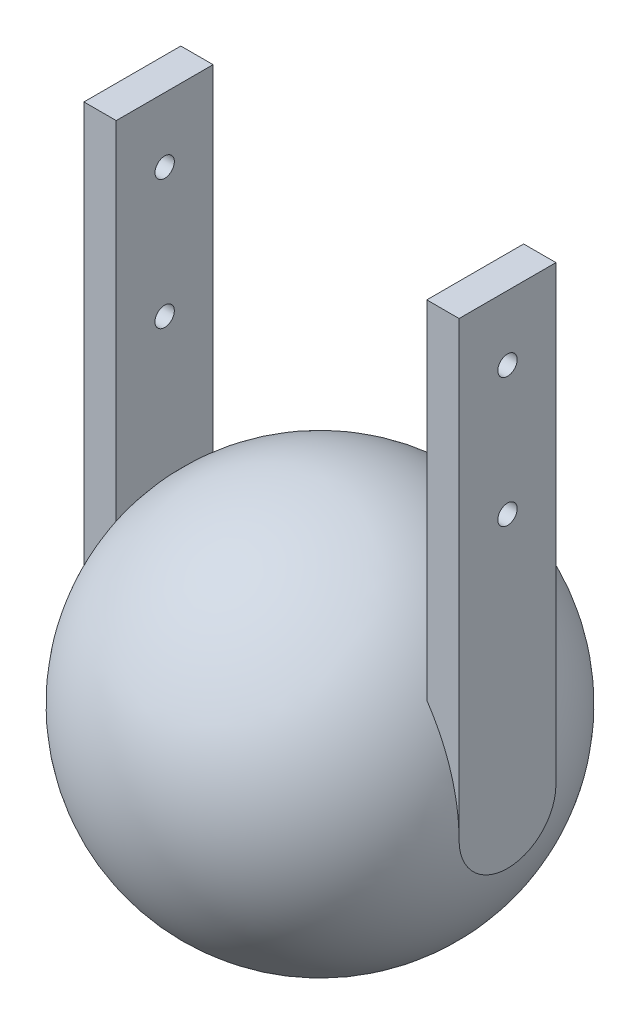
ISO-10303-21;
HEADER;
FILE_DESCRIPTION(('STEP AP214'),'2;1');
FILE_NAME('part.step','',(''),(''),'','','');
FILE_SCHEMA(('AUTOMOTIVE_DESIGN { 1 0 10303 214 1 1 1 1 }'));
ENDSEC;
DATA;
#1=APPLICATION_CONTEXT('core data for automotive mechanical design processes');
#2=APPLICATION_PROTOCOL_DEFINITION('international standard','automotive_design',2000,#1);
#3=PRODUCT_CONTEXT('',#1,'mechanical');
#4=PRODUCT('Part','Part','',(#3));
#5=PRODUCT_RELATED_PRODUCT_CATEGORY('part','',(#4));
#6=PRODUCT_DEFINITION_FORMATION('','',#4);
#7=PRODUCT_DEFINITION_CONTEXT('part definition',#1,'design');
#8=PRODUCT_DEFINITION('design','',#6,#7);
#9=PRODUCT_DEFINITION_SHAPE('','',#8);
#10=(LENGTH_UNIT() NAMED_UNIT(*) SI_UNIT(.MILLI.,.METRE.));
#11=(NAMED_UNIT(*) PLANE_ANGLE_UNIT() SI_UNIT($,.RADIAN.));
#12=(NAMED_UNIT(*) SI_UNIT($,.STERADIAN.) SOLID_ANGLE_UNIT());
#13=UNCERTAINTY_MEASURE_WITH_UNIT(LENGTH_MEASURE(1.E-05),#10,'distance_accuracy_value','');
#14=(GEOMETRIC_REPRESENTATION_CONTEXT(3) GLOBAL_UNCERTAINTY_ASSIGNED_CONTEXT((#13)) GLOBAL_UNIT_ASSIGNED_CONTEXT((#10,
#11,#12)) REPRESENTATION_CONTEXT('',''));
#15=CARTESIAN_POINT('',(0.,0.,0.));
#16=DIRECTION('',(0.,0.,1.));
#17=DIRECTION('',(1.,0.,0.));
#18=AXIS2_PLACEMENT_3D('',#15,#16,#17);
#19=CARTESIAN_POINT('',(0.,0.,0.));
#20=DIRECTION('',(-1.,0.,0.));
#21=DIRECTION('',(0.,0.,-1.));
#22=AXIS2_PLACEMENT_3D('',#19,#20,#21);
#23=SPHERICAL_SURFACE('',#22,30.);
#24=CARTESIAN_POINT('',(0.,0.,-7.5));
#25=DIRECTION('',(0.,0.,-1.));
#26=DIRECTION('',(0.,1.,0.));
#27=AXIS2_PLACEMENT_3D('',#24,#25,#26);
#28=CIRCLE('',#27,29.0473750965556);
#29=CARTESIAN_POINT('',(29.0473750965556,0.,-7.5));
#30=VERTEX_POINT('',#29);
#31=CARTESIAN_POINT('',(24.0473750965556,16.293365243729,-7.5));
#32=VERTEX_POINT('',#31);
#33=EDGE_CURVE('E116',#30,#32,#28,.F.);
#34=ORIENTED_EDGE('',*,*,#33,.F.);
#35=CARTESIAN_POINT('',(29.0473750965556,0.,0.));
#36=DIRECTION('',(-1.,0.,0.));
#37=DIRECTION('',(0.,0.,1.));
#38=AXIS2_PLACEMENT_3D('',#35,#36,#37);
#39=CIRCLE('',#38,7.5);
#40=CARTESIAN_POINT('',(29.0473750965556,0.,7.5));
#41=VERTEX_POINT('',#40);
#42=EDGE_CURVE('E195',#30,#41,#39,.T.);
#43=ORIENTED_EDGE('',*,*,#42,.T.);
#44=CARTESIAN_POINT('',(0.,0.,7.5));
#45=DIRECTION('',(0.,0.,1.));
#46=DIRECTION('',(0.,-1.,0.));
#47=AXIS2_PLACEMENT_3D('',#44,#45,#46);
#48=CIRCLE('',#47,29.0473750965556);
#49=CARTESIAN_POINT('',(24.0473750965556,16.293365243729,7.5));
#50=VERTEX_POINT('',#49);
#51=EDGE_CURVE('E67',#50,#41,#48,.F.);
#52=ORIENTED_EDGE('',*,*,#51,.F.);
#53=CARTESIAN_POINT('',(24.0473750965556,0.,0.));
#54=DIRECTION('',(1.,0.,0.));
#55=DIRECTION('',(0.,0.,-1.));
#56=AXIS2_PLACEMENT_3D('',#53,#54,#55);
#57=CIRCLE('',#56,17.9366594148842);
#58=EDGE_CURVE('E11',#50,#32,#57,.F.);
#59=ORIENTED_EDGE('',*,*,#58,.T.);
#60=EDGE_LOOP('',(#34,#43,#52,#59));
#61=FACE_BOUND('',#60,.T.);
#62=CARTESIAN_POINT('',(-24.0473750965556,0.,0.));
#63=DIRECTION('',(-1.,0.,0.));
#64=DIRECTION('',(0.,0.,1.));
#65=AXIS2_PLACEMENT_3D('',#62,#63,#64);
#66=CIRCLE('',#65,17.9366594148842);
#67=CARTESIAN_POINT('',(-24.0473750965556,16.293365243729,-7.5));
#68=VERTEX_POINT('',#67);
#69=CARTESIAN_POINT('',(-24.0473750965556,16.293365243729,7.5));
#70=VERTEX_POINT('',#69);
#71=EDGE_CURVE('E56',#68,#70,#66,.F.);
#72=ORIENTED_EDGE('',*,*,#71,.T.);
#73=CARTESIAN_POINT('',(0.,0.,7.5));
#74=DIRECTION('',(0.,0.,-1.));
#75=DIRECTION('',(0.,1.,0.));
#76=AXIS2_PLACEMENT_3D('',#73,#74,#75);
#77=CIRCLE('',#76,29.0473750965556);
#78=CARTESIAN_POINT('',(-29.0473750965556,0.,7.5));
#79=VERTEX_POINT('',#78);
#80=EDGE_CURVE('E191',#70,#79,#77,.F.);
#81=ORIENTED_EDGE('',*,*,#80,.T.);
#82=CARTESIAN_POINT('',(-29.0473750965556,0.,0.));
#83=DIRECTION('',(-1.,0.,0.));
#84=DIRECTION('',(0.,0.,1.));
#85=AXIS2_PLACEMENT_3D('',#82,#83,#84);
#86=CIRCLE('',#85,7.5);
#87=CARTESIAN_POINT('',(-29.0473750965556,0.,-7.5));
#88=VERTEX_POINT('',#87);
#89=EDGE_CURVE('E198',#88,#79,#86,.T.);
#90=ORIENTED_EDGE('',*,*,#89,.F.);
#91=CARTESIAN_POINT('',(0.,0.,-7.5));
#92=DIRECTION('',(0.,0.,1.));
#93=DIRECTION('',(0.,-1.,0.));
#94=AXIS2_PLACEMENT_3D('',#91,#92,#93);
#95=CIRCLE('',#94,29.0473750965556);
#96=EDGE_CURVE('E187',#88,#68,#95,.F.);
#97=ORIENTED_EDGE('',*,*,#96,.T.);
#98=EDGE_LOOP('',(#72,#81,#90,#97));
#99=FACE_BOUND('',#98,.T.);
#100=ADVANCED_FACE('F47',(#61,#99),#23,.T.);
#101=CARTESIAN_POINT('',(-29.0473750965556,0.,0.));
#102=DIRECTION('',(-1.,0.,0.));
#103=DIRECTION('',(0.,0.,1.));
#104=AXIS2_PLACEMENT_3D('',#101,#102,#103);
#105=PLANE('',#104);
#106=CARTESIAN_POINT('',(-29.0473750965556,60.,0.));
#107=DIRECTION('',(-1.,0.,0.));
#108=DIRECTION('',(0.,0.,1.));
#109=AXIS2_PLACEMENT_3D('',#106,#107,#108);
#110=CIRCLE('',#109,1.49999999999999);
#111=CARTESIAN_POINT('',(-29.0473750965556,60.,1.49999999999999));
#112=VERTEX_POINT('',#111);
#113=EDGE_CURVE('E229',#112,#112,#110,.T.);
#114=ORIENTED_EDGE('',*,*,#113,.F.);
#115=EDGE_LOOP('',(#114));
#116=FACE_BOUND('',#115,.T.);
#117=CARTESIAN_POINT('',(-29.0473750965556,40.,0.));
#118=DIRECTION('',(-1.,0.,0.));
#119=DIRECTION('',(0.,0.,1.));
#120=AXIS2_PLACEMENT_3D('',#117,#118,#119);
#121=CIRCLE('',#120,1.49999999999999);
#122=CARTESIAN_POINT('',(-29.0473750965556,40.,1.49999999999999));
#123=VERTEX_POINT('',#122);
#124=EDGE_CURVE('E214',#123,#123,#121,.T.);
#125=ORIENTED_EDGE('',*,*,#124,.F.);
#126=EDGE_LOOP('',(#125));
#127=FACE_BOUND('',#126,.T.);
#128=ORIENTED_EDGE('',*,*,#89,.T.);
#129=DIRECTION('',(0.,-1.,0.));
#130=VECTOR('',#129,1.);
#131=CARTESIAN_POINT('',(-29.0473750965556,70.,7.49999999999999));
#132=LINE('',#131,#130);
#133=CARTESIAN_POINT('',(-29.0473750965556,70.,7.49999999999999));
#134=VERTEX_POINT('',#133);
#135=EDGE_CURVE('E175',#134,#79,#132,.T.);
#136=ORIENTED_EDGE('',*,*,#135,.F.);
#137=DIRECTION('',(0.,0.,1.));
#138=VECTOR('',#137,1.);
#139=CARTESIAN_POINT('',(-29.0473750965556,70.,-7.49999999999999));
#140=LINE('',#139,#138);
#141=CARTESIAN_POINT('',(-29.0473750965556,70.,-7.49999999999999));
#142=VERTEX_POINT('',#141);
#143=EDGE_CURVE('E158',#142,#134,#140,.T.);
#144=ORIENTED_EDGE('',*,*,#143,.F.);
#145=DIRECTION('',(0.,1.,0.));
#146=VECTOR('',#145,1.);
#147=CARTESIAN_POINT('',(-29.0473750965556,0.,-7.5));
#148=LINE('',#147,#146);
#149=EDGE_CURVE('E164',#88,#142,#148,.T.);
#150=ORIENTED_EDGE('',*,*,#149,.F.);
#151=EDGE_LOOP('',(#128,#136,#144,#150));
#152=FACE_BOUND('',#151,.T.);
#153=ADVANCED_FACE('F237',(#116,#127,#152),#105,.T.);
#154=CARTESIAN_POINT('',(29.0473750965556,0.,-1.00778326990998E-13));
#155=DIRECTION('',(1.,0.,0.));
#156=DIRECTION('',(0.,0.,-1.));
#157=AXIS2_PLACEMENT_3D('',#154,#155,#156);
#158=PLANE('',#157);
#159=CARTESIAN_POINT('',(29.0473750965556,60.,0.));
#160=DIRECTION('',(-1.,0.,0.));
#161=DIRECTION('',(0.,0.,1.));
#162=AXIS2_PLACEMENT_3D('',#159,#160,#161);
#163=CIRCLE('',#162,1.49999999999999);
#164=CARTESIAN_POINT('',(29.0473750965556,60.,1.49999999999999));
#165=VERTEX_POINT('',#164);
#166=EDGE_CURVE('E225',#165,#165,#163,.T.);
#167=ORIENTED_EDGE('',*,*,#166,.T.);
#168=EDGE_LOOP('',(#167));
#169=FACE_BOUND('',#168,.T.);
#170=CARTESIAN_POINT('',(29.0473750965556,40.,0.));
#171=DIRECTION('',(-1.,0.,0.));
#172=DIRECTION('',(0.,0.,1.));
#173=AXIS2_PLACEMENT_3D('',#170,#171,#172);
#174=CIRCLE('',#173,1.49999999999999);
#175=CARTESIAN_POINT('',(29.0473750965556,40.,1.49999999999999));
#176=VERTEX_POINT('',#175);
#177=EDGE_CURVE('E207',#176,#176,#174,.T.);
#178=ORIENTED_EDGE('',*,*,#177,.T.);
#179=EDGE_LOOP('',(#178));
#180=FACE_BOUND('',#179,.T.);
#181=ORIENTED_EDGE('',*,*,#42,.F.);
#182=DIRECTION('',(0.,1.,0.));
#183=VECTOR('',#182,1.);
#184=CARTESIAN_POINT('',(29.0473750965556,0.,-7.5));
#185=LINE('',#184,#183);
#186=CARTESIAN_POINT('',(29.0473750965556,70.,-7.49999999999999));
#187=VERTEX_POINT('',#186);
#188=EDGE_CURVE('E140',#30,#187,#185,.T.);
#189=ORIENTED_EDGE('',*,*,#188,.T.);
#190=DIRECTION('',(0.,0.,1.));
#191=VECTOR('',#190,1.);
#192=CARTESIAN_POINT('',(29.0473750965556,70.,-7.49999999999999));
#193=LINE('',#192,#191);
#194=CARTESIAN_POINT('',(29.0473750965556,70.,7.49999999999999));
#195=VERTEX_POINT('',#194);
#196=EDGE_CURVE('E128',#187,#195,#193,.T.);
#197=ORIENTED_EDGE('',*,*,#196,.T.);
#198=DIRECTION('',(0.,-1.,0.));
#199=VECTOR('',#198,1.);
#200=CARTESIAN_POINT('',(29.0473750965556,70.,7.49999999999999));
#201=LINE('',#200,#199);
#202=EDGE_CURVE('E136',#195,#41,#201,.T.);
#203=ORIENTED_EDGE('',*,*,#202,.T.);
#204=EDGE_LOOP('',(#181,#189,#197,#203));
#205=FACE_BOUND('',#204,.T.);
#206=ADVANCED_FACE('F240',(#169,#180,#205),#158,.T.);
#207=CARTESIAN_POINT('',(-24.0473750965556,70.,-7.49999999999999));
#208=DIRECTION('',(0.,-1.,0.));
#209=DIRECTION('',(0.,0.,-1.));
#210=AXIS2_PLACEMENT_3D('',#207,#208,#209);
#211=PLANE('',#210);
#212=ORIENTED_EDGE('',*,*,#143,.T.);
#213=DIRECTION('',(-1.,0.,0.));
#214=VECTOR('',#213,1.);
#215=CARTESIAN_POINT('',(-24.0473750965556,70.,7.49999999999999));
#216=LINE('',#215,#214);
#217=CARTESIAN_POINT('',(-24.0473750965556,70.,7.49999999999999));
#218=VERTEX_POINT('',#217);
#219=EDGE_CURVE('E183',#218,#134,#216,.T.);
#220=ORIENTED_EDGE('',*,*,#219,.F.);
#221=DIRECTION('',(0.,0.,1.));
#222=VECTOR('',#221,1.);
#223=CARTESIAN_POINT('',(-24.0473750965556,70.,-7.49999999999999));
#224=LINE('',#223,#222);
#225=CARTESIAN_POINT('',(-24.0473750965556,70.,-7.49999999999999));
#226=VERTEX_POINT('',#225);
#227=EDGE_CURVE('E159',#226,#218,#224,.T.);
#228=ORIENTED_EDGE('',*,*,#227,.F.);
#229=DIRECTION('',(-1.,0.,0.));
#230=VECTOR('',#229,1.);
#231=CARTESIAN_POINT('',(-24.0473750965556,70.,-7.49999999999999));
#232=LINE('',#231,#230);
#233=EDGE_CURVE('E171',#226,#142,#232,.T.);
#234=ORIENTED_EDGE('',*,*,#233,.T.);
#235=EDGE_LOOP('',(#212,#220,#228,#234));
#236=FACE_BOUND('',#235,.T.);
#237=ADVANCED_FACE('F256',(#236),#211,.F.);
#238=CARTESIAN_POINT('',(-24.0473750965556,70.,7.49999999999999));
#239=DIRECTION('',(0.,0.,-1.));
#240=DIRECTION('',(0.,1.,0.));
#241=AXIS2_PLACEMENT_3D('',#238,#239,#240);
#242=PLANE('',#241);
#243=ORIENTED_EDGE('',*,*,#80,.F.);
#244=DIRECTION('',(0.,-1.,0.));
#245=VECTOR('',#244,1.);
#246=CARTESIAN_POINT('',(-24.0473750965556,70.,7.49999999999999));
#247=LINE('',#246,#245);
#248=EDGE_CURVE('E163',#218,#70,#247,.T.);
#249=ORIENTED_EDGE('',*,*,#248,.F.);
#250=ORIENTED_EDGE('',*,*,#219,.T.);
#251=ORIENTED_EDGE('',*,*,#135,.T.);
#252=EDGE_LOOP('',(#243,#249,#250,#251));
#253=FACE_BOUND('',#252,.T.);
#254=ADVANCED_FACE('F248',(#253),#242,.F.);
#255=CARTESIAN_POINT('',(-24.0473750965556,0.,-7.5));
#256=DIRECTION('',(0.,0.,1.));
#257=DIRECTION('',(0.,-1.,0.));
#258=AXIS2_PLACEMENT_3D('',#255,#256,#257);
#259=PLANE('',#258);
#260=ORIENTED_EDGE('',*,*,#96,.F.);
#261=ORIENTED_EDGE('',*,*,#149,.T.);
#262=ORIENTED_EDGE('',*,*,#233,.F.);
#263=DIRECTION('',(0.,1.,0.));
#264=VECTOR('',#263,1.);
#265=CARTESIAN_POINT('',(-24.0473750965556,0.,-7.5));
#266=LINE('',#265,#264);
#267=EDGE_CURVE('E168',#68,#226,#266,.T.);
#268=ORIENTED_EDGE('',*,*,#267,.F.);
#269=EDGE_LOOP('',(#260,#261,#262,#268));
#270=FACE_BOUND('',#269,.T.);
#271=ADVANCED_FACE('F258',(#270),#259,.F.);
#272=CARTESIAN_POINT('',(-24.0473750965556,0.,0.));
#273=DIRECTION('',(-1.,0.,0.));
#274=DIRECTION('',(0.,0.,1.));
#275=AXIS2_PLACEMENT_3D('',#272,#273,#274);
#276=PLANE('',#275);
#277=CARTESIAN_POINT('',(-24.0473750965556,60.,0.));
#278=DIRECTION('',(-1.,0.,0.));
#279=DIRECTION('',(0.,0.,1.));
#280=AXIS2_PLACEMENT_3D('',#277,#278,#279);
#281=CIRCLE('',#280,1.49999999999999);
#282=CARTESIAN_POINT('',(-24.0473750965556,60.,1.49999999999999));
#283=VERTEX_POINT('',#282);
#284=EDGE_CURVE('E50',#283,#283,#281,.T.);
#285=ORIENTED_EDGE('',*,*,#284,.T.);
#286=EDGE_LOOP('',(#285));
#287=FACE_BOUND('',#286,.T.);
#288=CARTESIAN_POINT('',(-24.0473750965556,40.,0.));
#289=DIRECTION('',(-1.,0.,0.));
#290=DIRECTION('',(0.,0.,1.));
#291=AXIS2_PLACEMENT_3D('',#288,#289,#290);
#292=CIRCLE('',#291,1.49999999999999);
#293=CARTESIAN_POINT('',(-24.0473750965556,40.,1.49999999999999));
#294=VERTEX_POINT('',#293);
#295=EDGE_CURVE('E143',#294,#294,#292,.T.);
#296=ORIENTED_EDGE('',*,*,#295,.T.);
#297=EDGE_LOOP('',(#296));
#298=FACE_BOUND('',#297,.T.);
#299=ORIENTED_EDGE('',*,*,#71,.F.);
#300=ORIENTED_EDGE('',*,*,#267,.T.);
#301=ORIENTED_EDGE('',*,*,#227,.T.);
#302=ORIENTED_EDGE('',*,*,#248,.T.);
#303=EDGE_LOOP('',(#299,#300,#301,#302));
#304=FACE_BOUND('',#303,.T.);
#305=ADVANCED_FACE('F250',(#287,#298,#304),#276,.F.);
#306=CARTESIAN_POINT('',(24.0473750965556,70.,-7.49999999999999));
#307=DIRECTION('',(0.,1.,0.));
#308=DIRECTION('',(0.,0.,1.));
#309=AXIS2_PLACEMENT_3D('',#306,#307,#308);
#310=PLANE('',#309);
#311=ORIENTED_EDGE('',*,*,#196,.F.);
#312=DIRECTION('',(1.,0.,0.));
#313=VECTOR('',#312,1.);
#314=CARTESIAN_POINT('',(24.0473750965556,70.,-7.49999999999999));
#315=LINE('',#314,#313);
#316=CARTESIAN_POINT('',(24.0473750965556,70.,-7.49999999999999));
#317=VERTEX_POINT('',#316);
#318=EDGE_CURVE('E114',#317,#187,#315,.T.);
#319=ORIENTED_EDGE('',*,*,#318,.F.);
#320=DIRECTION('',(0.,0.,1.));
#321=VECTOR('',#320,1.);
#322=CARTESIAN_POINT('',(24.0473750965556,70.,-7.49999999999999));
#323=LINE('',#322,#321);
#324=CARTESIAN_POINT('',(24.0473750965556,70.,7.49999999999999));
#325=VERTEX_POINT('',#324);
#326=EDGE_CURVE('E121',#317,#325,#323,.T.);
#327=ORIENTED_EDGE('',*,*,#326,.T.);
#328=DIRECTION('',(1.,0.,0.));
#329=VECTOR('',#328,1.);
#330=CARTESIAN_POINT('',(24.0473750965556,70.,7.49999999999999));
#331=LINE('',#330,#329);
#332=EDGE_CURVE('E131',#325,#195,#331,.T.);
#333=ORIENTED_EDGE('',*,*,#332,.T.);
#334=EDGE_LOOP('',(#311,#319,#327,#333));
#335=FACE_BOUND('',#334,.T.);
#336=ADVANCED_FACE('F125',(#335),#310,.T.);
#337=CARTESIAN_POINT('',(24.0473750965556,0.,-7.5));
#338=DIRECTION('',(0.,0.,-1.));
#339=DIRECTION('',(0.,1.,0.));
#340=AXIS2_PLACEMENT_3D('',#337,#338,#339);
#341=PLANE('',#340);
#342=ORIENTED_EDGE('',*,*,#188,.F.);
#343=ORIENTED_EDGE('',*,*,#33,.T.);
#344=DIRECTION('',(0.,1.,0.));
#345=VECTOR('',#344,1.);
#346=CARTESIAN_POINT('',(24.0473750965556,0.,-7.5));
#347=LINE('',#346,#345);
#348=EDGE_CURVE('E110',#32,#317,#347,.T.);
#349=ORIENTED_EDGE('',*,*,#348,.T.);
#350=ORIENTED_EDGE('',*,*,#318,.T.);
#351=EDGE_LOOP('',(#342,#343,#349,#350));
#352=FACE_BOUND('',#351,.T.);
#353=ADVANCED_FACE('F113',(#352),#341,.T.);
#354=CARTESIAN_POINT('',(24.0473750965556,70.,7.49999999999999));
#355=DIRECTION('',(0.,0.,1.));
#356=DIRECTION('',(0.,-1.,0.));
#357=AXIS2_PLACEMENT_3D('',#354,#355,#356);
#358=PLANE('',#357);
#359=DIRECTION('',(0.,-1.,0.));
#360=VECTOR('',#359,1.);
#361=CARTESIAN_POINT('',(24.0473750965556,70.,7.49999999999999));
#362=LINE('',#361,#360);
#363=EDGE_CURVE('E120',#325,#50,#362,.T.);
#364=ORIENTED_EDGE('',*,*,#363,.T.);
#365=ORIENTED_EDGE('',*,*,#51,.T.);
#366=ORIENTED_EDGE('',*,*,#202,.F.);
#367=ORIENTED_EDGE('',*,*,#332,.F.);
#368=EDGE_LOOP('',(#364,#365,#366,#367));
#369=FACE_BOUND('',#368,.T.);
#370=ADVANCED_FACE('F274',(#369),#358,.T.);
#371=CARTESIAN_POINT('',(24.0473750965556,0.,0.));
#372=DIRECTION('',(1.,0.,0.));
#373=DIRECTION('',(0.,0.,1.));
#374=AXIS2_PLACEMENT_3D('',#371,#372,#373);
#375=PLANE('',#374);
#376=CARTESIAN_POINT('',(24.0473750965556,60.,0.));
#377=DIRECTION('',(1.,0.,0.));
#378=DIRECTION('',(0.,0.,-1.));
#379=AXIS2_PLACEMENT_3D('',#376,#377,#378);
#380=CIRCLE('',#379,1.49999999999999);
#381=CARTESIAN_POINT('',(24.0473750965556,60.,-1.49999999999999));
#382=VERTEX_POINT('',#381);
#383=EDGE_CURVE('E219',#382,#382,#380,.T.);
#384=ORIENTED_EDGE('',*,*,#383,.T.);
#385=EDGE_LOOP('',(#384));
#386=FACE_BOUND('',#385,.T.);
#387=CARTESIAN_POINT('',(24.0473750965556,40.,0.));
#388=DIRECTION('',(1.,0.,0.));
#389=DIRECTION('',(0.,0.,-1.));
#390=AXIS2_PLACEMENT_3D('',#387,#388,#389);
#391=CIRCLE('',#390,1.49999999999999);
#392=CARTESIAN_POINT('',(24.0473750965556,40.,-1.49999999999999));
#393=VERTEX_POINT('',#392);
#394=EDGE_CURVE('E204',#393,#393,#391,.T.);
#395=ORIENTED_EDGE('',*,*,#394,.T.);
#396=EDGE_LOOP('',(#395));
#397=FACE_BOUND('',#396,.T.);
#398=ORIENTED_EDGE('',*,*,#58,.F.);
#399=ORIENTED_EDGE('',*,*,#363,.F.);
#400=ORIENTED_EDGE('',*,*,#326,.F.);
#401=ORIENTED_EDGE('',*,*,#348,.F.);
#402=EDGE_LOOP('',(#398,#399,#400,#401));
#403=FACE_BOUND('',#402,.T.);
#404=ADVANCED_FACE('F133',(#386,#397,#403),#375,.F.);
#405=CARTESIAN_POINT('',(-29.0473750965556,40.,0.));
#406=DIRECTION('',(-1.,0.,0.));
#407=DIRECTION('',(0.,0.,1.));
#408=AXIS2_PLACEMENT_3D('',#405,#406,#407);
#409=CYLINDRICAL_SURFACE('',#408,1.49999999999999);
#410=ORIENTED_EDGE('',*,*,#177,.F.);
#411=EDGE_LOOP('',(#410));
#412=FACE_BOUND('',#411,.T.);
#413=ORIENTED_EDGE('',*,*,#394,.F.);
#414=EDGE_LOOP('',(#413));
#415=FACE_BOUND('',#414,.T.);
#416=ADVANCED_FACE('F281',(#412,#415),#409,.F.);
#417=ORIENTED_EDGE('',*,*,#124,.T.);
#418=EDGE_LOOP('',(#417));
#419=FACE_BOUND('',#418,.T.);
#420=ORIENTED_EDGE('',*,*,#295,.F.);
#421=EDGE_LOOP('',(#420));
#422=FACE_BOUND('',#421,.T.);
#423=ADVANCED_FACE('F317',(#419,#422),#409,.F.);
#424=CARTESIAN_POINT('',(-29.0473750965556,60.,0.));
#425=DIRECTION('',(-1.,0.,0.));
#426=DIRECTION('',(0.,0.,1.));
#427=AXIS2_PLACEMENT_3D('',#424,#425,#426);
#428=CYLINDRICAL_SURFACE('',#427,1.49999999999999);
#429=ORIENTED_EDGE('',*,*,#113,.T.);
#430=EDGE_LOOP('',(#429));
#431=FACE_BOUND('',#430,.T.);
#432=ORIENTED_EDGE('',*,*,#284,.F.);
#433=EDGE_LOOP('',(#432));
#434=FACE_BOUND('',#433,.T.);
#435=ADVANCED_FACE('F234',(#431,#434),#428,.F.);
#436=ORIENTED_EDGE('',*,*,#166,.F.);
#437=EDGE_LOOP('',(#436));
#438=FACE_BOUND('',#437,.T.);
#439=ORIENTED_EDGE('',*,*,#383,.F.);
#440=EDGE_LOOP('',(#439));
#441=FACE_BOUND('',#440,.T.);
#442=ADVANCED_FACE('F334',(#438,#441),#428,.F.);
#443=CLOSED_SHELL('',(#100,#153,#206,#237,#254,#271,#305,#336,#353,#370,#404,#416,#423,#435,#442));
#444=MANIFOLD_SOLID_BREP('B2',#443);
#445=ADVANCED_BREP_SHAPE_REPRESENTATION('',(#18,#444),#14);
#446=SHAPE_DEFINITION_REPRESENTATION(#9,#445);
ENDSEC;
END-ISO-10303-21;
